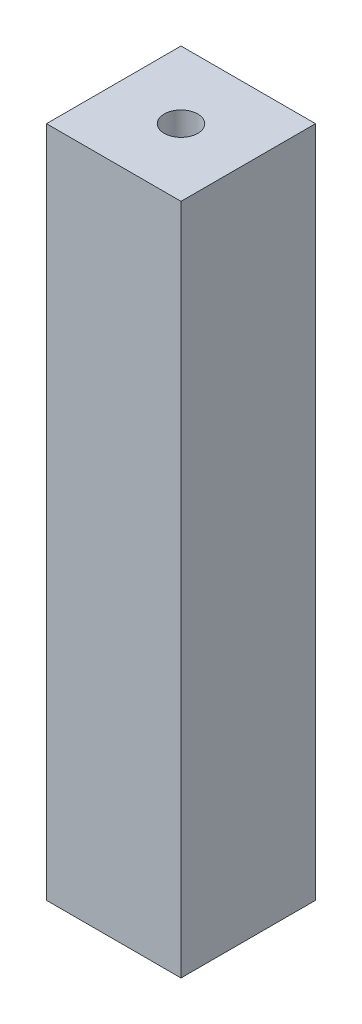
ISO-10303-21;
HEADER;
FILE_DESCRIPTION(('STEP AP214'),'2;1');
FILE_NAME('part.step','',(''),(''),'','','');
FILE_SCHEMA(('AUTOMOTIVE_DESIGN { 1 0 10303 214 1 1 1 1 }'));
ENDSEC;
DATA;
#1=APPLICATION_CONTEXT('core data for automotive mechanical design processes');
#2=APPLICATION_PROTOCOL_DEFINITION('international standard','automotive_design',2000,#1);
#3=PRODUCT_CONTEXT('',#1,'mechanical');
#4=PRODUCT('Part','Part','',(#3));
#5=PRODUCT_RELATED_PRODUCT_CATEGORY('part','',(#4));
#6=PRODUCT_DEFINITION_FORMATION('','',#4);
#7=PRODUCT_DEFINITION_CONTEXT('part definition',#1,'design');
#8=PRODUCT_DEFINITION('design','',#6,#7);
#9=PRODUCT_DEFINITION_SHAPE('','',#8);
#10=(LENGTH_UNIT() NAMED_UNIT(*) SI_UNIT(.MILLI.,.METRE.));
#11=(NAMED_UNIT(*) PLANE_ANGLE_UNIT() SI_UNIT($,.RADIAN.));
#12=(NAMED_UNIT(*) SI_UNIT($,.STERADIAN.) SOLID_ANGLE_UNIT());
#13=UNCERTAINTY_MEASURE_WITH_UNIT(LENGTH_MEASURE(1.E-05),#10,'distance_accuracy_value','');
#14=(GEOMETRIC_REPRESENTATION_CONTEXT(3) GLOBAL_UNCERTAINTY_ASSIGNED_CONTEXT((#13)) GLOBAL_UNIT_ASSIGNED_CONTEXT((#10,
#11,#12)) REPRESENTATION_CONTEXT('',''));
#15=CARTESIAN_POINT('',(0.,0.,0.));
#16=DIRECTION('',(0.,0.,1.));
#17=DIRECTION('',(1.,0.,0.));
#18=AXIS2_PLACEMENT_3D('',#15,#16,#17);
#19=CARTESIAN_POINT('',(-10.,100.,10.));
#20=DIRECTION('',(1.,0.,0.));
#21=DIRECTION('',(0.,0.,-1.));
#22=AXIS2_PLACEMENT_3D('',#19,#20,#21);
#23=PLANE('',#22);
#24=DIRECTION('',(0.,0.,1.));
#25=VECTOR('',#24,1.);
#26=CARTESIAN_POINT('',(-10.,0.,10.));
#27=LINE('',#26,#25);
#28=CARTESIAN_POINT('',(-10.,0.,-10.));
#29=VERTEX_POINT('',#28);
#30=CARTESIAN_POINT('',(-10.,0.,10.));
#31=VERTEX_POINT('',#30);
#32=EDGE_CURVE('E98',#29,#31,#27,.T.);
#33=ORIENTED_EDGE('',*,*,#32,.T.);
#34=DIRECTION('',(0.,-1.,0.));
#35=VECTOR('',#34,1.);
#36=CARTESIAN_POINT('',(-10.,100.,10.));
#37=LINE('',#36,#35);
#38=CARTESIAN_POINT('',(-10.,100.,10.));
#39=VERTEX_POINT('',#38);
#40=EDGE_CURVE('E11',#39,#31,#37,.T.);
#41=ORIENTED_EDGE('',*,*,#40,.F.);
#42=DIRECTION('',(0.,0.,1.));
#43=VECTOR('',#42,1.);
#44=CARTESIAN_POINT('',(-10.,100.,10.));
#45=LINE('',#44,#43);
#46=CARTESIAN_POINT('',(-10.,100.,-10.));
#47=VERTEX_POINT('',#46);
#48=EDGE_CURVE('E85',#47,#39,#45,.T.);
#49=ORIENTED_EDGE('',*,*,#48,.F.);
#50=DIRECTION('',(0.,-1.,0.));
#51=VECTOR('',#50,1.);
#52=CARTESIAN_POINT('',(-10.,100.,-10.));
#53=LINE('',#52,#51);
#54=EDGE_CURVE('E94',#47,#29,#53,.T.);
#55=ORIENTED_EDGE('',*,*,#54,.T.);
#56=EDGE_LOOP('',(#33,#41,#49,#55));
#57=FACE_BOUND('',#56,.T.);
#58=ADVANCED_FACE('F33',(#57),#23,.F.);
#59=CARTESIAN_POINT('',(10.,100.,10.));
#60=DIRECTION('',(0.,0.,-1.));
#61=DIRECTION('',(-1.,0.,0.));
#62=AXIS2_PLACEMENT_3D('',#59,#60,#61);
#63=PLANE('',#62);
#64=DIRECTION('',(1.,0.,0.));
#65=VECTOR('',#64,1.);
#66=CARTESIAN_POINT('',(10.,0.,10.));
#67=LINE('',#66,#65);
#68=CARTESIAN_POINT('',(10.,0.,10.));
#69=VERTEX_POINT('',#68);
#70=EDGE_CURVE('E89',#31,#69,#67,.T.);
#71=ORIENTED_EDGE('',*,*,#70,.T.);
#72=DIRECTION('',(0.,-1.,0.));
#73=VECTOR('',#72,1.);
#74=CARTESIAN_POINT('',(10.,100.,10.));
#75=LINE('',#74,#73);
#76=CARTESIAN_POINT('',(10.,100.,10.));
#77=VERTEX_POINT('',#76);
#78=EDGE_CURVE('E42',#77,#69,#75,.T.);
#79=ORIENTED_EDGE('',*,*,#78,.F.);
#80=DIRECTION('',(1.,0.,0.));
#81=VECTOR('',#80,1.);
#82=CARTESIAN_POINT('',(10.,100.,10.));
#83=LINE('',#82,#81);
#84=EDGE_CURVE('E80',#39,#77,#83,.T.);
#85=ORIENTED_EDGE('',*,*,#84,.F.);
#86=ORIENTED_EDGE('',*,*,#40,.T.);
#87=EDGE_LOOP('',(#71,#79,#85,#86));
#88=FACE_BOUND('',#87,.T.);
#89=ADVANCED_FACE('F88',(#88),#63,.F.);
#90=CARTESIAN_POINT('',(10.,100.,10.));
#91=DIRECTION('',(-1.,0.,0.));
#92=DIRECTION('',(0.,0.,1.));
#93=AXIS2_PLACEMENT_3D('',#90,#91,#92);
#94=PLANE('',#93);
#95=DIRECTION('',(0.,0.,-1.));
#96=VECTOR('',#95,1.);
#97=CARTESIAN_POINT('',(10.,0.,10.));
#98=LINE('',#97,#96);
#99=CARTESIAN_POINT('',(10.,0.,-10.));
#100=VERTEX_POINT('',#99);
#101=EDGE_CURVE('E67',#69,#100,#98,.T.);
#102=ORIENTED_EDGE('',*,*,#101,.T.);
#103=DIRECTION('',(0.,-1.,0.));
#104=VECTOR('',#103,1.);
#105=CARTESIAN_POINT('',(10.,100.,-10.));
#106=LINE('',#105,#104);
#107=CARTESIAN_POINT('',(10.,100.,-10.));
#108=VERTEX_POINT('',#107);
#109=EDGE_CURVE('E90',#108,#100,#106,.T.);
#110=ORIENTED_EDGE('',*,*,#109,.F.);
#111=DIRECTION('',(0.,0.,-1.));
#112=VECTOR('',#111,1.);
#113=CARTESIAN_POINT('',(10.,100.,10.));
#114=LINE('',#113,#112);
#115=EDGE_CURVE('E83',#77,#108,#114,.T.);
#116=ORIENTED_EDGE('',*,*,#115,.F.);
#117=ORIENTED_EDGE('',*,*,#78,.T.);
#118=EDGE_LOOP('',(#102,#110,#116,#117));
#119=FACE_BOUND('',#118,.T.);
#120=ADVANCED_FACE('F92',(#119),#94,.F.);
#121=CARTESIAN_POINT('',(10.,100.,-10.));
#122=DIRECTION('',(0.,0.,1.));
#123=DIRECTION('',(1.,0.,0.));
#124=AXIS2_PLACEMENT_3D('',#121,#122,#123);
#125=PLANE('',#124);
#126=DIRECTION('',(-1.,0.,0.));
#127=VECTOR('',#126,1.);
#128=CARTESIAN_POINT('',(10.,0.,-10.));
#129=LINE('',#128,#127);
#130=EDGE_CURVE('E73',#100,#29,#129,.T.);
#131=ORIENTED_EDGE('',*,*,#130,.T.);
#132=ORIENTED_EDGE('',*,*,#54,.F.);
#133=DIRECTION('',(-1.,0.,0.));
#134=VECTOR('',#133,1.);
#135=CARTESIAN_POINT('',(10.,100.,-10.));
#136=LINE('',#135,#134);
#137=EDGE_CURVE('E50',#108,#47,#136,.T.);
#138=ORIENTED_EDGE('',*,*,#137,.F.);
#139=ORIENTED_EDGE('',*,*,#109,.T.);
#140=EDGE_LOOP('',(#131,#132,#138,#139));
#141=FACE_BOUND('',#140,.T.);
#142=ADVANCED_FACE('F105',(#141),#125,.F.);
#143=CARTESIAN_POINT('',(0.,100.,0.));
#144=DIRECTION('',(0.,1.,0.));
#145=DIRECTION('',(0.,0.,1.));
#146=AXIS2_PLACEMENT_3D('',#143,#144,#145);
#147=PLANE('',#146);
#148=CARTESIAN_POINT('',(0.,100.,0.));
#149=DIRECTION('',(0.,1.,0.));
#150=DIRECTION('',(0.,0.,1.));
#151=AXIS2_PLACEMENT_3D('',#148,#149,#150);
#152=CIRCLE('',#151,2.5);
#153=CARTESIAN_POINT('',(0.,100.,2.5));
#154=VERTEX_POINT('',#153);
#155=EDGE_CURVE('E111',#154,#154,#152,.T.);
#156=ORIENTED_EDGE('',*,*,#155,.F.);
#157=EDGE_LOOP('',(#156));
#158=FACE_BOUND('',#157,.T.);
#159=ORIENTED_EDGE('',*,*,#48,.T.);
#160=ORIENTED_EDGE('',*,*,#84,.T.);
#161=ORIENTED_EDGE('',*,*,#115,.T.);
#162=ORIENTED_EDGE('',*,*,#137,.T.);
#163=EDGE_LOOP('',(#159,#160,#161,#162));
#164=FACE_BOUND('',#163,.T.);
#165=ADVANCED_FACE('F81',(#158,#164),#147,.T.);
#166=CARTESIAN_POINT('',(0.,0.,0.));
#167=DIRECTION('',(0.,1.,0.));
#168=DIRECTION('',(0.,0.,1.));
#169=AXIS2_PLACEMENT_3D('',#166,#167,#168);
#170=PLANE('',#169);
#171=CARTESIAN_POINT('',(0.,0.,0.));
#172=DIRECTION('',(0.,1.,0.));
#173=DIRECTION('',(0.,0.,1.));
#174=AXIS2_PLACEMENT_3D('',#171,#172,#173);
#175=CIRCLE('',#174,2.5);
#176=CARTESIAN_POINT('',(0.,0.,2.5));
#177=VERTEX_POINT('',#176);
#178=EDGE_CURVE('E36',#177,#177,#175,.T.);
#179=ORIENTED_EDGE('',*,*,#178,.T.);
#180=EDGE_LOOP('',(#179));
#181=FACE_BOUND('',#180,.T.);
#182=ORIENTED_EDGE('',*,*,#32,.F.);
#183=ORIENTED_EDGE('',*,*,#130,.F.);
#184=ORIENTED_EDGE('',*,*,#101,.F.);
#185=ORIENTED_EDGE('',*,*,#70,.F.);
#186=EDGE_LOOP('',(#182,#183,#184,#185));
#187=FACE_BOUND('',#186,.T.);
#188=ADVANCED_FACE('F108',(#181,#187),#170,.F.);
#189=CARTESIAN_POINT('',(0.,-4.00000000000003,0.));
#190=DIRECTION('',(0.,1.,0.));
#191=DIRECTION('',(0.,0.,1.));
#192=AXIS2_PLACEMENT_3D('',#189,#190,#191);
#193=CYLINDRICAL_SURFACE('',#192,2.5);
#194=CARTESIAN_POINT('',(0.,100.,2.5));
#195=CARTESIAN_POINT('',(0.,98.9583333333333,2.5));
#196=CARTESIAN_POINT('',(0.,97.9166666666667,2.5));
#197=CARTESIAN_POINT('',(0.,95.8333333333333,2.5));
#198=CARTESIAN_POINT('',(0.,94.7916666666666,2.5));
#199=CARTESIAN_POINT('',(0.,92.7083333333333,2.5));
#200=CARTESIAN_POINT('',(0.,91.6666666666667,2.5));
#201=CARTESIAN_POINT('',(0.,89.5833333333333,2.5));
#202=CARTESIAN_POINT('',(0.,88.5416666666667,2.5));
#203=CARTESIAN_POINT('',(0.,86.4583333333333,2.5));
#204=CARTESIAN_POINT('',(0.,85.4166666666667,2.5));
#205=CARTESIAN_POINT('',(0.,83.3333333333333,2.5));
#206=CARTESIAN_POINT('',(0.,82.2916666666667,2.5));
#207=CARTESIAN_POINT('',(0.,80.2083333333333,2.5));
#208=CARTESIAN_POINT('',(0.,79.1666666666666,2.5));
#209=CARTESIAN_POINT('',(0.,77.0833333333333,2.5));
#210=CARTESIAN_POINT('',(0.,76.0416666666667,2.5));
#211=CARTESIAN_POINT('',(0.,73.9583333333333,2.5));
#212=CARTESIAN_POINT('',(0.,72.9166666666667,2.5));
#213=CARTESIAN_POINT('',(0.,70.8333333333333,2.5));
#214=CARTESIAN_POINT('',(0.,69.7916666666667,2.5));
#215=CARTESIAN_POINT('',(0.,67.7083333333333,2.5));
#216=CARTESIAN_POINT('',(0.,66.6666666666667,2.5));
#217=CARTESIAN_POINT('',(0.,64.5833333333333,2.5));
#218=CARTESIAN_POINT('',(0.,63.5416666666667,2.5));
#219=CARTESIAN_POINT('',(0.,61.4583333333333,2.5));
#220=CARTESIAN_POINT('',(0.,60.4166666666667,2.5));
#221=CARTESIAN_POINT('',(0.,58.3333333333333,2.5));
#222=CARTESIAN_POINT('',(0.,57.2916666666667,2.5));
#223=CARTESIAN_POINT('',(0.,55.2083333333333,2.5));
#224=CARTESIAN_POINT('',(0.,54.1666666666667,2.5));
#225=CARTESIAN_POINT('',(0.,52.0833333333333,2.5));
#226=CARTESIAN_POINT('',(0.,51.0416666666667,2.5));
#227=CARTESIAN_POINT('',(0.,48.9583333333333,2.5));
#228=CARTESIAN_POINT('',(0.,47.9166666666667,2.5));
#229=CARTESIAN_POINT('',(0.,45.8333333333333,2.5));
#230=CARTESIAN_POINT('',(0.,44.7916666666667,2.5));
#231=CARTESIAN_POINT('',(0.,42.7083333333333,2.5));
#232=CARTESIAN_POINT('',(0.,41.6666666666667,2.5));
#233=CARTESIAN_POINT('',(0.,39.5833333333333,2.5));
#234=CARTESIAN_POINT('',(0.,38.5416666666667,2.5));
#235=CARTESIAN_POINT('',(0.,36.4583333333333,2.5));
#236=CARTESIAN_POINT('',(0.,35.4166666666667,2.5));
#237=CARTESIAN_POINT('',(0.,33.3333333333333,2.5));
#238=CARTESIAN_POINT('',(0.,32.2916666666667,2.5));
#239=CARTESIAN_POINT('',(0.,30.2083333333333,2.5));
#240=CARTESIAN_POINT('',(0.,29.1666666666667,2.5));
#241=CARTESIAN_POINT('',(0.,27.0833333333333,2.5));
#242=CARTESIAN_POINT('',(0.,26.0416666666667,2.5));
#243=CARTESIAN_POINT('',(0.,23.9583333333333,2.5));
#244=CARTESIAN_POINT('',(0.,22.9166666666667,2.5));
#245=CARTESIAN_POINT('',(0.,20.8333333333333,2.5));
#246=CARTESIAN_POINT('',(0.,19.7916666666667,2.5));
#247=CARTESIAN_POINT('',(0.,17.7083333333333,2.5));
#248=CARTESIAN_POINT('',(0.,16.6666666666667,2.5));
#249=CARTESIAN_POINT('',(0.,14.5833333333333,2.5));
#250=CARTESIAN_POINT('',(0.,13.5416666666667,2.5));
#251=CARTESIAN_POINT('',(0.,11.4583333333333,2.5));
#252=CARTESIAN_POINT('',(0.,10.4166666666667,2.5));
#253=CARTESIAN_POINT('',(0.,8.33333333333333,2.5));
#254=CARTESIAN_POINT('',(0.,7.29166666666667,2.5));
#255=CARTESIAN_POINT('',(0.,5.20833333333334,2.5));
#256=CARTESIAN_POINT('',(0.,4.16666666666667,2.5));
#257=CARTESIAN_POINT('',(0.,2.08333333333333,2.5));
#258=CARTESIAN_POINT('',(0.,1.04166666666667,2.5));
#259=CARTESIAN_POINT('',(0.,0.,2.5));
#260=B_SPLINE_CURVE_WITH_KNOTS('',3,(#194,#195,#196,#197,#198,#199,#200,#201,#202,#203,#204,
#205,#206,#207,#208,#209,#210,#211,#212,#213,#214,#215,#216,#217,#218,#219,#220,#221,#222,#223,
#224,#225,#226,#227,#228,#229,#230,#231,#232,#233,#234,#235,#236,#237,#238,#239,#240,#241,#242,
#243,#244,#245,#246,#247,#248,#249,#250,#251,#252,#253,#254,#255,#256,#257,#258,#259),
.UNSPECIFIED.,.F.,.F.,(4,2,2,2,2,2,2,2,2,2,2,2,2,2,2,2,2,2,2,2,2,2,2,2,2,2,2,2,2,2,2,2,4),(0.,
3.125,6.25000000000001,9.37499999999999,12.5,15.625,18.75,21.875,25.,28.125,31.25,34.375,37.5,
40.625,43.75,46.875,50.,53.125,56.25,59.375,62.5,65.625,68.75,71.875,75.,78.125,81.25,84.375,
87.5,90.625,93.75,96.875,100.),.UNSPECIFIED.);
#261=EDGE_CURVE('BSEAM119',#154,#177,#260,.T.);
#262=ORIENTED_EDGE('',*,*,#155,.T.);
#263=ORIENTED_EDGE('',*,*,#178,.F.);
#264=ORIENTED_EDGE('',*,*,#261,.T.);
#265=ORIENTED_EDGE('',*,*,#261,.F.);
#266=EDGE_LOOP('',(#262,#264,#263,#265));
#267=FACE_BOUND('',#266,.T.);
#268=ADVANCED_FACE('F119',(#267),#193,.F.);
#269=CLOSED_SHELL('',(#58,#89,#120,#142,#165,#188,#268));
#270=MANIFOLD_SOLID_BREP('B2',#269);
#271=ADVANCED_BREP_SHAPE_REPRESENTATION('',(#18,#270),#14);
#272=SHAPE_DEFINITION_REPRESENTATION(#9,#271);
ENDSEC;
END-ISO-10303-21;
